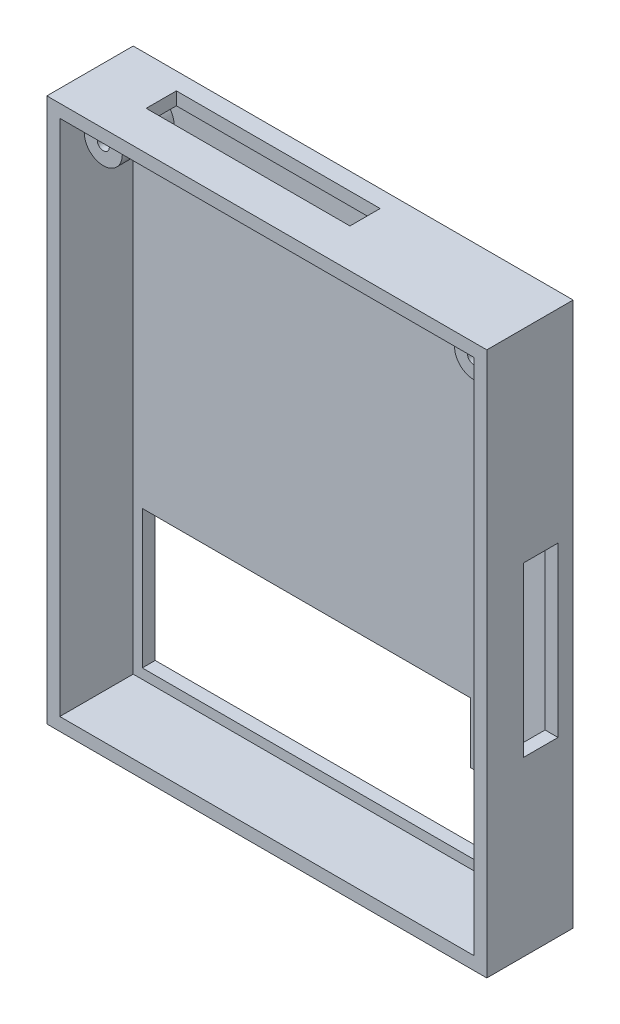
ISO-10303-21;
HEADER;
FILE_DESCRIPTION(('STEP AP214'),'2;1');
FILE_NAME('part.step','',(''),(''),'','','');
FILE_SCHEMA(('AUTOMOTIVE_DESIGN { 1 0 10303 214 1 1 1 1 }'));
ENDSEC;
DATA;
#1=APPLICATION_CONTEXT('core data for automotive mechanical design processes');
#2=APPLICATION_PROTOCOL_DEFINITION('international standard','automotive_design',2000,#1);
#3=PRODUCT_CONTEXT('',#1,'mechanical');
#4=PRODUCT('Part','Part','',(#3));
#5=PRODUCT_RELATED_PRODUCT_CATEGORY('part','',(#4));
#6=PRODUCT_DEFINITION_FORMATION('','',#4);
#7=PRODUCT_DEFINITION_CONTEXT('part definition',#1,'design');
#8=PRODUCT_DEFINITION('design','',#6,#7);
#9=PRODUCT_DEFINITION_SHAPE('','',#8);
#10=(LENGTH_UNIT() NAMED_UNIT(*) SI_UNIT(.MILLI.,.METRE.));
#11=(NAMED_UNIT(*) PLANE_ANGLE_UNIT() SI_UNIT($,.RADIAN.));
#12=(NAMED_UNIT(*) SI_UNIT($,.STERADIAN.) SOLID_ANGLE_UNIT());
#13=UNCERTAINTY_MEASURE_WITH_UNIT(LENGTH_MEASURE(1.E-05),#10,'distance_accuracy_value','');
#14=(GEOMETRIC_REPRESENTATION_CONTEXT(3) GLOBAL_UNCERTAINTY_ASSIGNED_CONTEXT((#13)) GLOBAL_UNIT_ASSIGNED_CONTEXT((#10,
#11,#12)) REPRESENTATION_CONTEXT('',''));
#15=CARTESIAN_POINT('',(0.,0.,0.));
#16=DIRECTION('',(0.,0.,1.));
#17=DIRECTION('',(1.,0.,0.));
#18=AXIS2_PLACEMENT_3D('',#15,#16,#17);
#19=CARTESIAN_POINT('',(0.,0.,3.));
#20=DIRECTION('',(0.,0.,-1.));
#21=DIRECTION('',(-1.,0.,0.));
#22=AXIS2_PLACEMENT_3D('',#19,#20,#21);
#23=PLANE('',#22);
#24=CARTESIAN_POINT('',(93.83,117.93,3.));
#25=DIRECTION('',(0.,0.,-1.));
#26=DIRECTION('',(-1.,0.,0.));
#27=AXIS2_PLACEMENT_3D('',#24,#25,#26);
#28=CIRCLE('',#27,4.4);
#29=CARTESIAN_POINT('',(89.43,117.93,3.));
#30=VERTEX_POINT('',#29);
#31=EDGE_CURVE('E48',#30,#30,#28,.F.);
#32=ORIENTED_EDGE('',*,*,#31,.F.);
#33=EDGE_LOOP('',(#32));
#34=FACE_BOUND('',#33,.T.);
#35=DIRECTION('',(1.,0.,0.));
#36=VECTOR('',#35,1.);
#37=CARTESIAN_POINT('',(5.1,5.3,3.));
#38=LINE('',#37,#36);
#39=CARTESIAN_POINT('',(5.1,5.3,3.));
#40=VERTEX_POINT('',#39);
#41=CARTESIAN_POINT('',(97.1,5.3,3.));
#42=VERTEX_POINT('',#41);
#43=EDGE_CURVE('E321',#40,#42,#38,.T.);
#44=ORIENTED_EDGE('',*,*,#43,.F.);
#45=DIRECTION('',(0.,-1.,0.));
#46=VECTOR('',#45,1.);
#47=CARTESIAN_POINT('',(5.1,37.3,3.));
#48=LINE('',#47,#46);
#49=CARTESIAN_POINT('',(5.1,37.3,3.));
#50=VERTEX_POINT('',#49);
#51=EDGE_CURVE('E309',#50,#40,#48,.T.);
#52=ORIENTED_EDGE('',*,*,#51,.F.);
#53=DIRECTION('',(-1.,0.,0.));
#54=VECTOR('',#53,1.);
#55=CARTESIAN_POINT('',(5.1,37.3,3.));
#56=LINE('',#55,#54);
#57=CARTESIAN_POINT('',(81.1,37.3,3.));
#58=VERTEX_POINT('',#57);
#59=EDGE_CURVE('E337',#58,#50,#56,.T.);
#60=ORIENTED_EDGE('',*,*,#59,.F.);
#61=DIRECTION('',(0.,1.,0.));
#62=VECTOR('',#61,1.);
#63=CARTESIAN_POINT('',(81.1,37.3,3.));
#64=LINE('',#63,#62);
#65=CARTESIAN_POINT('',(81.1,23.3,3.));
#66=VERTEX_POINT('',#65);
#67=EDGE_CURVE('E333',#66,#58,#64,.T.);
#68=ORIENTED_EDGE('',*,*,#67,.F.);
#69=DIRECTION('',(-1.,0.,0.));
#70=VECTOR('',#69,1.);
#71=CARTESIAN_POINT('',(81.1,23.3,3.));
#72=LINE('',#71,#70);
#73=CARTESIAN_POINT('',(97.1,23.3,3.));
#74=VERTEX_POINT('',#73);
#75=EDGE_CURVE('E329',#74,#66,#72,.T.);
#76=ORIENTED_EDGE('',*,*,#75,.F.);
#77=DIRECTION('',(0.,1.,0.));
#78=VECTOR('',#77,1.);
#79=CARTESIAN_POINT('',(97.1,23.3,3.));
#80=LINE('',#79,#78);
#81=EDGE_CURVE('E325',#42,#74,#80,.T.);
#82=ORIENTED_EDGE('',*,*,#81,.F.);
#83=EDGE_LOOP('',(#44,#52,#60,#68,#76,#82));
#84=FACE_BOUND('',#83,.T.);
#85=DIRECTION('',(0.,-1.,0.));
#86=VECTOR('',#85,1.);
#87=CARTESIAN_POINT('',(3.,0.,3.));
#88=LINE('',#87,#86);
#89=CARTESIAN_POINT('',(3.,123.,3.));
#90=VERTEX_POINT('',#89);
#91=CARTESIAN_POINT('',(3.,3.,3.));
#92=VERTEX_POINT('',#91);
#93=EDGE_CURVE('E199',#90,#92,#88,.T.);
#94=ORIENTED_EDGE('',*,*,#93,.T.);
#95=DIRECTION('',(1.,0.,0.));
#96=VECTOR('',#95,1.);
#97=CARTESIAN_POINT('',(0.,3.,3.));
#98=LINE('',#97,#96);
#99=CARTESIAN_POINT('',(98.9,3.,3.));
#100=VERTEX_POINT('',#99);
#101=EDGE_CURVE('E381',#92,#100,#98,.T.);
#102=ORIENTED_EDGE('',*,*,#101,.T.);
#103=DIRECTION('',(0.,1.,0.));
#104=VECTOR('',#103,1.);
#105=CARTESIAN_POINT('',(98.9,0.,3.));
#106=LINE('',#105,#104);
#107=CARTESIAN_POINT('',(98.9,123.,3.));
#108=VERTEX_POINT('',#107);
#109=EDGE_CURVE('E389',#100,#108,#106,.T.);
#110=ORIENTED_EDGE('',*,*,#109,.T.);
#111=DIRECTION('',(-1.,0.,0.));
#112=VECTOR('',#111,1.);
#113=CARTESIAN_POINT('',(0.,123.,3.));
#114=LINE('',#113,#112);
#115=EDGE_CURVE('E204',#108,#90,#114,.T.);
#116=ORIENTED_EDGE('',*,*,#115,.T.);
#117=EDGE_LOOP('',(#94,#102,#110,#116));
#118=FACE_BOUND('',#117,.T.);
#119=CARTESIAN_POINT('',(8.07,117.93,3.));
#120=DIRECTION('',(0.,0.,-1.));
#121=DIRECTION('',(-1.,0.,0.));
#122=AXIS2_PLACEMENT_3D('',#119,#120,#121);
#123=CIRCLE('',#122,4.4);
#124=CARTESIAN_POINT('',(3.67,117.93,3.));
#125=VERTEX_POINT('',#124);
#126=EDGE_CURVE('E11',#125,#125,#123,.F.);
#127=ORIENTED_EDGE('',*,*,#126,.F.);
#128=EDGE_LOOP('',(#127));
#129=FACE_BOUND('',#128,.T.);
#130=ADVANCED_FACE('F39',(#34,#84,#118,#129),#23,.F.);
#131=CARTESIAN_POINT('',(0.,0.,15.));
#132=DIRECTION('',(1.,0.,0.));
#133=DIRECTION('',(0.,0.,-1.));
#134=AXIS2_PLACEMENT_3D('',#131,#132,#133);
#135=PLANE('',#134);
#136=DIRECTION('',(0.,-1.,0.));
#137=VECTOR('',#136,1.);
#138=CARTESIAN_POINT('',(0.,0.,0.));
#139=LINE('',#138,#137);
#140=CARTESIAN_POINT('',(0.,126.,0.));
#141=VERTEX_POINT('',#140);
#142=CARTESIAN_POINT('',(0.,0.,0.));
#143=VERTEX_POINT('',#142);
#144=EDGE_CURVE('E384',#141,#143,#139,.T.);
#145=ORIENTED_EDGE('',*,*,#144,.T.);
#146=DIRECTION('',(0.,0.,-1.));
#147=VECTOR('',#146,1.);
#148=CARTESIAN_POINT('',(0.,0.,15.));
#149=LINE('',#148,#147);
#150=CARTESIAN_POINT('',(0.,0.,20.));
#151=VERTEX_POINT('',#150);
#152=EDGE_CURVE('E423',#151,#143,#149,.T.);
#153=ORIENTED_EDGE('',*,*,#152,.F.);
#154=DIRECTION('',(0.,-1.,0.));
#155=VECTOR('',#154,1.);
#156=CARTESIAN_POINT('',(0.,126.,20.));
#157=LINE('',#156,#155);
#158=CARTESIAN_POINT('',(0.,126.,20.));
#159=VERTEX_POINT('',#158);
#160=EDGE_CURVE('E230',#159,#151,#157,.T.);
#161=ORIENTED_EDGE('',*,*,#160,.F.);
#162=DIRECTION('',(0.,0.,-1.));
#163=VECTOR('',#162,1.);
#164=CARTESIAN_POINT('',(0.,126.,15.));
#165=LINE('',#164,#163);
#166=EDGE_CURVE('E411',#159,#141,#165,.T.);
#167=ORIENTED_EDGE('',*,*,#166,.T.);
#168=EDGE_LOOP('',(#145,#153,#161,#167));
#169=FACE_BOUND('',#168,.T.);
#170=ADVANCED_FACE('F41',(#169),#135,.F.);
#171=CARTESIAN_POINT('',(0.,0.,15.));
#172=DIRECTION('',(0.,1.,0.));
#173=DIRECTION('',(0.,0.,1.));
#174=AXIS2_PLACEMENT_3D('',#171,#172,#173);
#175=PLANE('',#174);
#176=DIRECTION('',(1.,0.,0.));
#177=VECTOR('',#176,1.);
#178=CARTESIAN_POINT('',(0.,0.,0.));
#179=LINE('',#178,#177);
#180=CARTESIAN_POINT('',(101.9,0.,0.));
#181=VERTEX_POINT('',#180);
#182=EDGE_CURVE('E402',#143,#181,#179,.T.);
#183=ORIENTED_EDGE('',*,*,#182,.T.);
#184=DIRECTION('',(0.,0.,-1.));
#185=VECTOR('',#184,1.);
#186=CARTESIAN_POINT('',(101.9,0.,15.));
#187=LINE('',#186,#185);
#188=CARTESIAN_POINT('',(101.9,0.,20.));
#189=VERTEX_POINT('',#188);
#190=EDGE_CURVE('E419',#189,#181,#187,.T.);
#191=ORIENTED_EDGE('',*,*,#190,.F.);
#192=DIRECTION('',(1.,0.,0.));
#193=VECTOR('',#192,1.);
#194=CARTESIAN_POINT('',(0.,0.,20.));
#195=LINE('',#194,#193);
#196=EDGE_CURVE('E234',#151,#189,#195,.T.);
#197=ORIENTED_EDGE('',*,*,#196,.F.);
#198=ORIENTED_EDGE('',*,*,#152,.T.);
#199=EDGE_LOOP('',(#183,#191,#197,#198));
#200=FACE_BOUND('',#199,.T.);
#201=ADVANCED_FACE('F574',(#200),#175,.F.);
#202=CARTESIAN_POINT('',(101.9,0.,15.));
#203=DIRECTION('',(-1.,0.,0.));
#204=DIRECTION('',(0.,0.,1.));
#205=AXIS2_PLACEMENT_3D('',#202,#203,#204);
#206=PLANE('',#205);
#207=DIRECTION('',(0.,0.,-1.));
#208=VECTOR('',#207,1.);
#209=CARTESIAN_POINT('',(101.9,40.,11.5));
#210=LINE('',#209,#208);
#211=CARTESIAN_POINT('',(101.9,40.,11.5));
#212=VERTEX_POINT('',#211);
#213=CARTESIAN_POINT('',(101.9,40.,3.5));
#214=VERTEX_POINT('',#213);
#215=EDGE_CURVE('E293',#212,#214,#210,.T.);
#216=ORIENTED_EDGE('',*,*,#215,.F.);
#217=DIRECTION('',(0.,-1.,0.));
#218=VECTOR('',#217,1.);
#219=CARTESIAN_POINT('',(101.9,79.,11.5));
#220=LINE('',#219,#218);
#221=CARTESIAN_POINT('',(101.9,79.,11.5));
#222=VERTEX_POINT('',#221);
#223=EDGE_CURVE('E283',#222,#212,#220,.T.);
#224=ORIENTED_EDGE('',*,*,#223,.F.);
#225=DIRECTION('',(0.,0.,1.));
#226=VECTOR('',#225,1.);
#227=CARTESIAN_POINT('',(101.9,79.,11.5));
#228=LINE('',#227,#226);
#229=CARTESIAN_POINT('',(101.9,79.,3.5));
#230=VERTEX_POINT('',#229);
#231=EDGE_CURVE('E301',#230,#222,#228,.T.);
#232=ORIENTED_EDGE('',*,*,#231,.F.);
#233=DIRECTION('',(0.,1.,0.));
#234=VECTOR('',#233,1.);
#235=CARTESIAN_POINT('',(101.9,79.,3.5));
#236=LINE('',#235,#234);
#237=EDGE_CURVE('E297',#214,#230,#236,.T.);
#238=ORIENTED_EDGE('',*,*,#237,.F.);
#239=EDGE_LOOP('',(#216,#224,#232,#238));
#240=FACE_BOUND('',#239,.T.);
#241=DIRECTION('',(0.,1.,0.));
#242=VECTOR('',#241,1.);
#243=CARTESIAN_POINT('',(101.9,0.,0.));
#244=LINE('',#243,#242);
#245=CARTESIAN_POINT('',(101.9,126.,0.));
#246=VERTEX_POINT('',#245);
#247=EDGE_CURVE('E405',#181,#246,#244,.T.);
#248=ORIENTED_EDGE('',*,*,#247,.T.);
#249=DIRECTION('',(0.,0.,-1.));
#250=VECTOR('',#249,1.);
#251=CARTESIAN_POINT('',(101.9,126.,15.));
#252=LINE('',#251,#250);
#253=CARTESIAN_POINT('',(101.9,126.,20.));
#254=VERTEX_POINT('',#253);
#255=EDGE_CURVE('E415',#254,#246,#252,.T.);
#256=ORIENTED_EDGE('',*,*,#255,.F.);
#257=DIRECTION('',(0.,1.,0.));
#258=VECTOR('',#257,1.);
#259=CARTESIAN_POINT('',(101.9,0.,20.));
#260=LINE('',#259,#258);
#261=EDGE_CURVE('E238',#189,#254,#260,.T.);
#262=ORIENTED_EDGE('',*,*,#261,.F.);
#263=ORIENTED_EDGE('',*,*,#190,.T.);
#264=EDGE_LOOP('',(#248,#256,#262,#263));
#265=FACE_BOUND('',#264,.T.);
#266=ADVANCED_FACE('F571',(#240,#265),#206,.F.);
#267=CARTESIAN_POINT('',(0.,126.,15.));
#268=DIRECTION('',(0.,-1.,0.));
#269=DIRECTION('',(0.,0.,-1.));
#270=AXIS2_PLACEMENT_3D('',#267,#268,#269);
#271=PLANE('',#270);
#272=DIRECTION('',(1.,0.,0.));
#273=VECTOR('',#272,1.);
#274=CARTESIAN_POINT('',(14.,126.,11.));
#275=LINE('',#274,#273);
#276=CARTESIAN_POINT('',(14.,126.,11.));
#277=VERTEX_POINT('',#276);
#278=CARTESIAN_POINT('',(61.2,126.,11.));
#279=VERTEX_POINT('',#278);
#280=EDGE_CURVE('E268',#277,#279,#275,.T.);
#281=ORIENTED_EDGE('',*,*,#280,.F.);
#282=DIRECTION('',(0.,0.,1.));
#283=VECTOR('',#282,1.);
#284=CARTESIAN_POINT('',(14.,126.,4.));
#285=LINE('',#284,#283);
#286=CARTESIAN_POINT('',(14.,126.,4.));
#287=VERTEX_POINT('',#286);
#288=EDGE_CURVE('E55',#287,#277,#285,.T.);
#289=ORIENTED_EDGE('',*,*,#288,.F.);
#290=DIRECTION('',(-1.,0.,0.));
#291=VECTOR('',#290,1.);
#292=CARTESIAN_POINT('',(14.,126.,4.));
#293=LINE('',#292,#291);
#294=CARTESIAN_POINT('',(61.2,126.,4.));
#295=VERTEX_POINT('',#294);
#296=EDGE_CURVE('E275',#295,#287,#293,.T.);
#297=ORIENTED_EDGE('',*,*,#296,.F.);
#298=DIRECTION('',(0.,0.,-1.));
#299=VECTOR('',#298,1.);
#300=CARTESIAN_POINT('',(61.2,126.,4.));
#301=LINE('',#300,#299);
#302=EDGE_CURVE('E271',#279,#295,#301,.T.);
#303=ORIENTED_EDGE('',*,*,#302,.F.);
#304=EDGE_LOOP('',(#281,#289,#297,#303));
#305=FACE_BOUND('',#304,.T.);
#306=DIRECTION('',(-1.,0.,0.));
#307=VECTOR('',#306,1.);
#308=CARTESIAN_POINT('',(0.,126.,0.));
#309=LINE('',#308,#307);
#310=EDGE_CURVE('E408',#246,#141,#309,.T.);
#311=ORIENTED_EDGE('',*,*,#310,.T.);
#312=ORIENTED_EDGE('',*,*,#166,.F.);
#313=DIRECTION('',(-1.,0.,0.));
#314=VECTOR('',#313,1.);
#315=CARTESIAN_POINT('',(101.9,126.,20.));
#316=LINE('',#315,#314);
#317=EDGE_CURVE('E226',#254,#159,#316,.T.);
#318=ORIENTED_EDGE('',*,*,#317,.F.);
#319=ORIENTED_EDGE('',*,*,#255,.T.);
#320=EDGE_LOOP('',(#311,#312,#318,#319));
#321=FACE_BOUND('',#320,.T.);
#322=ADVANCED_FACE('F567',(#305,#321),#271,.F.);
#323=CARTESIAN_POINT('',(0.,0.,0.));
#324=DIRECTION('',(0.,0.,-1.));
#325=DIRECTION('',(-1.,0.,0.));
#326=AXIS2_PLACEMENT_3D('',#323,#324,#325);
#327=PLANE('',#326);
#328=CARTESIAN_POINT('',(8.07,117.93,0.));
#329=DIRECTION('',(0.,0.,-1.));
#330=DIRECTION('',(-1.,0.,0.));
#331=AXIS2_PLACEMENT_3D('',#328,#329,#330);
#332=CIRCLE('',#331,1.4);
#333=CARTESIAN_POINT('',(6.67,117.93,0.));
#334=VERTEX_POINT('',#333);
#335=EDGE_CURVE('E262',#334,#334,#332,.T.);
#336=ORIENTED_EDGE('',*,*,#335,.F.);
#337=EDGE_LOOP('',(#336));
#338=FACE_BOUND('',#337,.T.);
#339=CARTESIAN_POINT('',(93.83,117.93,0.));
#340=DIRECTION('',(0.,0.,-1.));
#341=DIRECTION('',(-1.,0.,0.));
#342=AXIS2_PLACEMENT_3D('',#339,#340,#341);
#343=CIRCLE('',#342,1.4);
#344=CARTESIAN_POINT('',(92.43,117.93,0.));
#345=VERTEX_POINT('',#344);
#346=EDGE_CURVE('E258',#345,#345,#343,.T.);
#347=ORIENTED_EDGE('',*,*,#346,.F.);
#348=EDGE_LOOP('',(#347));
#349=FACE_BOUND('',#348,.T.);
#350=DIRECTION('',(0.,1.,0.));
#351=VECTOR('',#350,1.);
#352=CARTESIAN_POINT('',(5.1,0.,0.));
#353=LINE('',#352,#351);
#354=CARTESIAN_POINT('',(5.1,5.3,0.));
#355=VERTEX_POINT('',#354);
#356=CARTESIAN_POINT('',(5.1,37.3,0.));
#357=VERTEX_POINT('',#356);
#358=EDGE_CURVE('E376',#355,#357,#353,.T.);
#359=ORIENTED_EDGE('',*,*,#358,.F.);
#360=DIRECTION('',(-1.,0.,0.));
#361=VECTOR('',#360,1.);
#362=CARTESIAN_POINT('',(0.,5.3,0.));
#363=LINE('',#362,#361);
#364=CARTESIAN_POINT('',(97.1,5.3,0.));
#365=VERTEX_POINT('',#364);
#366=EDGE_CURVE('E345',#365,#355,#363,.T.);
#367=ORIENTED_EDGE('',*,*,#366,.F.);
#368=DIRECTION('',(0.,-1.,0.));
#369=VECTOR('',#368,1.);
#370=CARTESIAN_POINT('',(97.1,0.,0.));
#371=LINE('',#370,#369);
#372=CARTESIAN_POINT('',(97.1,23.3,0.));
#373=VERTEX_POINT('',#372);
#374=EDGE_CURVE('E363',#373,#365,#371,.T.);
#375=ORIENTED_EDGE('',*,*,#374,.F.);
#376=DIRECTION('',(1.,0.,0.));
#377=VECTOR('',#376,1.);
#378=CARTESIAN_POINT('',(0.,23.3,0.));
#379=LINE('',#378,#377);
#380=CARTESIAN_POINT('',(81.1,23.3,0.));
#381=VERTEX_POINT('',#380);
#382=EDGE_CURVE('E367',#381,#373,#379,.T.);
#383=ORIENTED_EDGE('',*,*,#382,.F.);
#384=DIRECTION('',(0.,-1.,0.));
#385=VECTOR('',#384,1.);
#386=CARTESIAN_POINT('',(81.1,0.,0.));
#387=LINE('',#386,#385);
#388=CARTESIAN_POINT('',(81.1,37.3,0.));
#389=VERTEX_POINT('',#388);
#390=EDGE_CURVE('E370',#389,#381,#387,.T.);
#391=ORIENTED_EDGE('',*,*,#390,.F.);
#392=DIRECTION('',(1.,0.,0.));
#393=VECTOR('',#392,1.);
#394=CARTESIAN_POINT('',(0.,37.3,0.));
#395=LINE('',#394,#393);
#396=EDGE_CURVE('E373',#357,#389,#395,.T.);
#397=ORIENTED_EDGE('',*,*,#396,.F.);
#398=EDGE_LOOP('',(#359,#367,#375,#383,#391,#397));
#399=FACE_BOUND('',#398,.T.);
#400=ORIENTED_EDGE('',*,*,#144,.F.);
#401=ORIENTED_EDGE('',*,*,#310,.F.);
#402=ORIENTED_EDGE('',*,*,#247,.F.);
#403=ORIENTED_EDGE('',*,*,#182,.F.);
#404=EDGE_LOOP('',(#400,#401,#402,#403));
#405=FACE_BOUND('',#404,.T.);
#406=ADVANCED_FACE('F554',(#338,#349,#399,#405),#327,.T.);
#407=CARTESIAN_POINT('',(3.,0.,15.));
#408=DIRECTION('',(1.,0.,0.));
#409=DIRECTION('',(0.,0.,-1.));
#410=AXIS2_PLACEMENT_3D('',#407,#408,#409);
#411=PLANE('',#410);
#412=ORIENTED_EDGE('',*,*,#93,.F.);
#413=DIRECTION('',(0.,0.,-1.));
#414=VECTOR('',#413,1.);
#415=CARTESIAN_POINT('',(3.,123.,15.));
#416=LINE('',#415,#414);
#417=CARTESIAN_POINT('',(3.,123.,20.));
#418=VERTEX_POINT('',#417);
#419=EDGE_CURVE('E191',#418,#90,#416,.T.);
#420=ORIENTED_EDGE('',*,*,#419,.F.);
#421=DIRECTION('',(0.,-1.,0.));
#422=VECTOR('',#421,1.);
#423=CARTESIAN_POINT('',(3.,123.,20.));
#424=LINE('',#423,#422);
#425=CARTESIAN_POINT('',(3.,3.,20.));
#426=VERTEX_POINT('',#425);
#427=EDGE_CURVE('E196',#418,#426,#424,.T.);
#428=ORIENTED_EDGE('',*,*,#427,.T.);
#429=DIRECTION('',(0.,0.,-1.));
#430=VECTOR('',#429,1.);
#431=CARTESIAN_POINT('',(3.,3.,15.));
#432=LINE('',#431,#430);
#433=EDGE_CURVE('E382',#426,#92,#432,.T.);
#434=ORIENTED_EDGE('',*,*,#433,.T.);
#435=EDGE_LOOP('',(#412,#420,#428,#434));
#436=FACE_BOUND('',#435,.T.);
#437=ADVANCED_FACE('F193',(#436),#411,.T.);
#438=CARTESIAN_POINT('',(0.,3.,15.));
#439=DIRECTION('',(0.,1.,0.));
#440=DIRECTION('',(0.,0.,1.));
#441=AXIS2_PLACEMENT_3D('',#438,#439,#440);
#442=PLANE('',#441);
#443=ORIENTED_EDGE('',*,*,#101,.F.);
#444=ORIENTED_EDGE('',*,*,#433,.F.);
#445=DIRECTION('',(1.,0.,0.));
#446=VECTOR('',#445,1.);
#447=CARTESIAN_POINT('',(3.,3.,20.));
#448=LINE('',#447,#446);
#449=CARTESIAN_POINT('',(98.9,3.,20.));
#450=VERTEX_POINT('',#449);
#451=EDGE_CURVE('E217',#426,#450,#448,.T.);
#452=ORIENTED_EDGE('',*,*,#451,.T.);
#453=DIRECTION('',(0.,0.,-1.));
#454=VECTOR('',#453,1.);
#455=CARTESIAN_POINT('',(98.9,3.,15.));
#456=LINE('',#455,#454);
#457=EDGE_CURVE('E385',#450,#100,#456,.T.);
#458=ORIENTED_EDGE('',*,*,#457,.T.);
#459=EDGE_LOOP('',(#443,#444,#452,#458));
#460=FACE_BOUND('',#459,.T.);
#461=ADVANCED_FACE('F553',(#460),#442,.T.);
#462=CARTESIAN_POINT('',(98.9,0.,15.));
#463=DIRECTION('',(-1.,0.,0.));
#464=DIRECTION('',(0.,0.,1.));
#465=AXIS2_PLACEMENT_3D('',#462,#463,#464);
#466=PLANE('',#465);
#467=DIRECTION('',(0.,1.,0.));
#468=VECTOR('',#467,1.);
#469=CARTESIAN_POINT('',(98.9,0.,11.5));
#470=LINE('',#469,#468);
#471=CARTESIAN_POINT('',(98.9,40.,11.5));
#472=VERTEX_POINT('',#471);
#473=CARTESIAN_POINT('',(98.9,79.,11.5));
#474=VERTEX_POINT('',#473);
#475=EDGE_CURVE('E437',#472,#474,#470,.T.);
#476=ORIENTED_EDGE('',*,*,#475,.F.);
#477=DIRECTION('',(0.,0.,1.));
#478=VECTOR('',#477,1.);
#479=CARTESIAN_POINT('',(98.9,40.,15.));
#480=LINE('',#479,#478);
#481=CARTESIAN_POINT('',(98.9,40.,3.5));
#482=VERTEX_POINT('',#481);
#483=EDGE_CURVE('E427',#482,#472,#480,.T.);
#484=ORIENTED_EDGE('',*,*,#483,.F.);
#485=DIRECTION('',(0.,-1.,0.));
#486=VECTOR('',#485,1.);
#487=CARTESIAN_POINT('',(98.9,0.,3.50000000000001));
#488=LINE('',#487,#486);
#489=CARTESIAN_POINT('',(98.9,79.,3.5));
#490=VERTEX_POINT('',#489);
#491=EDGE_CURVE('E430',#490,#482,#488,.T.);
#492=ORIENTED_EDGE('',*,*,#491,.F.);
#493=DIRECTION('',(0.,0.,-1.));
#494=VECTOR('',#493,1.);
#495=CARTESIAN_POINT('',(98.9,79.,15.));
#496=LINE('',#495,#494);
#497=EDGE_CURVE('E434',#474,#490,#496,.T.);
#498=ORIENTED_EDGE('',*,*,#497,.F.);
#499=EDGE_LOOP('',(#476,#484,#492,#498));
#500=FACE_BOUND('',#499,.T.);
#501=ORIENTED_EDGE('',*,*,#109,.F.);
#502=ORIENTED_EDGE('',*,*,#457,.F.);
#503=DIRECTION('',(0.,1.,0.));
#504=VECTOR('',#503,1.);
#505=CARTESIAN_POINT('',(98.9,3.,20.));
#506=LINE('',#505,#504);
#507=CARTESIAN_POINT('',(98.9,123.,20.));
#508=VERTEX_POINT('',#507);
#509=EDGE_CURVE('E221',#450,#508,#506,.T.);
#510=ORIENTED_EDGE('',*,*,#509,.T.);
#511=DIRECTION('',(0.,0.,-1.));
#512=VECTOR('',#511,1.);
#513=CARTESIAN_POINT('',(98.9,123.,15.));
#514=LINE('',#513,#512);
#515=EDGE_CURVE('E203',#508,#108,#514,.T.);
#516=ORIENTED_EDGE('',*,*,#515,.T.);
#517=EDGE_LOOP('',(#501,#502,#510,#516));
#518=FACE_BOUND('',#517,.T.);
#519=ADVANCED_FACE('F557',(#500,#518),#466,.T.);
#520=CARTESIAN_POINT('',(0.,123.,15.));
#521=DIRECTION('',(0.,-1.,0.));
#522=DIRECTION('',(0.,0.,-1.));
#523=AXIS2_PLACEMENT_3D('',#520,#521,#522);
#524=PLANE('',#523);
#525=DIRECTION('',(0.,0.,-1.));
#526=VECTOR('',#525,1.);
#527=CARTESIAN_POINT('',(14.,123.,15.));
#528=LINE('',#527,#526);
#529=CARTESIAN_POINT('',(14.,123.,11.));
#530=VERTEX_POINT('',#529);
#531=CARTESIAN_POINT('',(14.,123.,4.));
#532=VERTEX_POINT('',#531);
#533=EDGE_CURVE('E449',#530,#532,#528,.T.);
#534=ORIENTED_EDGE('',*,*,#533,.F.);
#535=DIRECTION('',(-1.,0.,0.));
#536=VECTOR('',#535,1.);
#537=CARTESIAN_POINT('',(0.,123.,11.));
#538=LINE('',#537,#536);
#539=CARTESIAN_POINT('',(61.2,123.,11.));
#540=VERTEX_POINT('',#539);
#541=EDGE_CURVE('E440',#540,#530,#538,.T.);
#542=ORIENTED_EDGE('',*,*,#541,.F.);
#543=DIRECTION('',(0.,0.,1.));
#544=VECTOR('',#543,1.);
#545=CARTESIAN_POINT('',(61.2,123.,15.));
#546=LINE('',#545,#544);
#547=CARTESIAN_POINT('',(61.2,123.,4.));
#548=VERTEX_POINT('',#547);
#549=EDGE_CURVE('E443',#548,#540,#546,.T.);
#550=ORIENTED_EDGE('',*,*,#549,.F.);
#551=DIRECTION('',(1.,0.,0.));
#552=VECTOR('',#551,1.);
#553=CARTESIAN_POINT('',(0.,123.,4.));
#554=LINE('',#553,#552);
#555=EDGE_CURVE('E446',#532,#548,#554,.T.);
#556=ORIENTED_EDGE('',*,*,#555,.F.);
#557=EDGE_LOOP('',(#534,#542,#550,#556));
#558=FACE_BOUND('',#557,.T.);
#559=ORIENTED_EDGE('',*,*,#115,.F.);
#560=ORIENTED_EDGE('',*,*,#515,.F.);
#561=DIRECTION('',(-1.,0.,0.));
#562=VECTOR('',#561,1.);
#563=CARTESIAN_POINT('',(98.9,123.,20.));
#564=LINE('',#563,#562);
#565=EDGE_CURVE('E207',#508,#418,#564,.T.);
#566=ORIENTED_EDGE('',*,*,#565,.T.);
#567=ORIENTED_EDGE('',*,*,#419,.T.);
#568=EDGE_LOOP('',(#559,#560,#566,#567));
#569=FACE_BOUND('',#568,.T.);
#570=ADVANCED_FACE('F208',(#558,#569),#524,.T.);
#571=CARTESIAN_POINT('',(5.1,37.3,-12.));
#572=DIRECTION('',(-1.,0.,0.));
#573=DIRECTION('',(0.,-1.,0.));
#574=AXIS2_PLACEMENT_3D('',#571,#572,#573);
#575=PLANE('',#574);
#576=ORIENTED_EDGE('',*,*,#358,.T.);
#577=DIRECTION('',(0.,0.,1.));
#578=VECTOR('',#577,1.);
#579=CARTESIAN_POINT('',(5.1,37.3,-12.));
#580=LINE('',#579,#578);
#581=EDGE_CURVE('E342',#357,#50,#580,.T.);
#582=ORIENTED_EDGE('',*,*,#581,.T.);
#583=ORIENTED_EDGE('',*,*,#51,.T.);
#584=DIRECTION('',(0.,0.,1.));
#585=VECTOR('',#584,1.);
#586=CARTESIAN_POINT('',(5.1,5.3,-12.));
#587=LINE('',#586,#585);
#588=EDGE_CURVE('E341',#355,#40,#587,.T.);
#589=ORIENTED_EDGE('',*,*,#588,.F.);
#590=EDGE_LOOP('',(#576,#582,#583,#589));
#591=FACE_BOUND('',#590,.T.);
#592=ADVANCED_FACE('F532',(#591),#575,.F.);
#593=CARTESIAN_POINT('',(5.1,37.3,-12.));
#594=DIRECTION('',(0.,1.,0.));
#595=DIRECTION('',(0.,0.,1.));
#596=AXIS2_PLACEMENT_3D('',#593,#594,#595);
#597=PLANE('',#596);
#598=ORIENTED_EDGE('',*,*,#396,.T.);
#599=DIRECTION('',(0.,0.,1.));
#600=VECTOR('',#599,1.);
#601=CARTESIAN_POINT('',(81.1,37.3,-12.));
#602=LINE('',#601,#600);
#603=EDGE_CURVE('E346',#389,#58,#602,.T.);
#604=ORIENTED_EDGE('',*,*,#603,.T.);
#605=ORIENTED_EDGE('',*,*,#59,.T.);
#606=ORIENTED_EDGE('',*,*,#581,.F.);
#607=EDGE_LOOP('',(#598,#604,#605,#606));
#608=FACE_BOUND('',#607,.T.);
#609=ADVANCED_FACE('F528',(#608),#597,.F.);
#610=CARTESIAN_POINT('',(81.1,37.3,-12.));
#611=DIRECTION('',(1.,0.,0.));
#612=DIRECTION('',(0.,0.,-1.));
#613=AXIS2_PLACEMENT_3D('',#610,#611,#612);
#614=PLANE('',#613);
#615=ORIENTED_EDGE('',*,*,#390,.T.);
#616=DIRECTION('',(0.,0.,1.));
#617=VECTOR('',#616,1.);
#618=CARTESIAN_POINT('',(81.1,23.3,-12.));
#619=LINE('',#618,#617);
#620=EDGE_CURVE('E349',#381,#66,#619,.T.);
#621=ORIENTED_EDGE('',*,*,#620,.T.);
#622=ORIENTED_EDGE('',*,*,#67,.T.);
#623=ORIENTED_EDGE('',*,*,#603,.F.);
#624=EDGE_LOOP('',(#615,#621,#622,#623));
#625=FACE_BOUND('',#624,.T.);
#626=ADVANCED_FACE('F531',(#625),#614,.F.);
#627=CARTESIAN_POINT('',(81.1,23.3,-12.));
#628=DIRECTION('',(0.,1.,0.));
#629=DIRECTION('',(0.,0.,1.));
#630=AXIS2_PLACEMENT_3D('',#627,#628,#629);
#631=PLANE('',#630);
#632=ORIENTED_EDGE('',*,*,#382,.T.);
#633=DIRECTION('',(0.,0.,1.));
#634=VECTOR('',#633,1.);
#635=CARTESIAN_POINT('',(97.1,23.3,-12.));
#636=LINE('',#635,#634);
#637=EDGE_CURVE('E352',#373,#74,#636,.T.);
#638=ORIENTED_EDGE('',*,*,#637,.T.);
#639=ORIENTED_EDGE('',*,*,#75,.T.);
#640=ORIENTED_EDGE('',*,*,#620,.F.);
#641=EDGE_LOOP('',(#632,#638,#639,#640));
#642=FACE_BOUND('',#641,.T.);
#643=ADVANCED_FACE('F536',(#642),#631,.F.);
#644=CARTESIAN_POINT('',(97.1,23.3,-12.));
#645=DIRECTION('',(1.,0.,0.));
#646=DIRECTION('',(0.,0.,-1.));
#647=AXIS2_PLACEMENT_3D('',#644,#645,#646);
#648=PLANE('',#647);
#649=ORIENTED_EDGE('',*,*,#374,.T.);
#650=DIRECTION('',(0.,0.,1.));
#651=VECTOR('',#650,1.);
#652=CARTESIAN_POINT('',(97.1,5.3,-12.));
#653=LINE('',#652,#651);
#654=EDGE_CURVE('E355',#365,#42,#653,.T.);
#655=ORIENTED_EDGE('',*,*,#654,.T.);
#656=ORIENTED_EDGE('',*,*,#81,.T.);
#657=ORIENTED_EDGE('',*,*,#637,.F.);
#658=EDGE_LOOP('',(#649,#655,#656,#657));
#659=FACE_BOUND('',#658,.T.);
#660=ADVANCED_FACE('F540',(#659),#648,.F.);
#661=CARTESIAN_POINT('',(5.1,5.3,-12.));
#662=DIRECTION('',(0.,-1.,0.));
#663=DIRECTION('',(0.,0.,-1.));
#664=AXIS2_PLACEMENT_3D('',#661,#662,#663);
#665=PLANE('',#664);
#666=ORIENTED_EDGE('',*,*,#366,.T.);
#667=ORIENTED_EDGE('',*,*,#588,.T.);
#668=ORIENTED_EDGE('',*,*,#43,.T.);
#669=ORIENTED_EDGE('',*,*,#654,.F.);
#670=EDGE_LOOP('',(#666,#667,#668,#669));
#671=FACE_BOUND('',#670,.T.);
#672=ADVANCED_FACE('F526',(#671),#665,.F.);
#673=CARTESIAN_POINT('',(86.9,79.,11.5));
#674=DIRECTION('',(0.,0.,1.));
#675=DIRECTION('',(0.,-1.,0.));
#676=AXIS2_PLACEMENT_3D('',#673,#674,#675);
#677=PLANE('',#676);
#678=ORIENTED_EDGE('',*,*,#475,.T.);
#679=DIRECTION('',(1.,0.,0.));
#680=VECTOR('',#679,1.);
#681=CARTESIAN_POINT('',(86.9,79.,11.5));
#682=LINE('',#681,#680);
#683=EDGE_CURVE('E306',#474,#222,#682,.T.);
#684=ORIENTED_EDGE('',*,*,#683,.T.);
#685=ORIENTED_EDGE('',*,*,#223,.T.);
#686=DIRECTION('',(1.,0.,0.));
#687=VECTOR('',#686,1.);
#688=CARTESIAN_POINT('',(86.9,40.,11.5));
#689=LINE('',#688,#687);
#690=EDGE_CURVE('E305',#472,#212,#689,.T.);
#691=ORIENTED_EDGE('',*,*,#690,.F.);
#692=EDGE_LOOP('',(#678,#684,#685,#691));
#693=FACE_BOUND('',#692,.T.);
#694=ADVANCED_FACE('F516',(#693),#677,.F.);
#695=CARTESIAN_POINT('',(86.9,79.,11.5));
#696=DIRECTION('',(0.,1.,0.));
#697=DIRECTION('',(0.,0.,1.));
#698=AXIS2_PLACEMENT_3D('',#695,#696,#697);
#699=PLANE('',#698);
#700=ORIENTED_EDGE('',*,*,#497,.T.);
#701=DIRECTION('',(1.,0.,0.));
#702=VECTOR('',#701,1.);
#703=CARTESIAN_POINT('',(86.9,79.,3.5));
#704=LINE('',#703,#702);
#705=EDGE_CURVE('E310',#490,#230,#704,.T.);
#706=ORIENTED_EDGE('',*,*,#705,.T.);
#707=ORIENTED_EDGE('',*,*,#231,.T.);
#708=ORIENTED_EDGE('',*,*,#683,.F.);
#709=EDGE_LOOP('',(#700,#706,#707,#708));
#710=FACE_BOUND('',#709,.T.);
#711=ADVANCED_FACE('F512',(#710),#699,.F.);
#712=CARTESIAN_POINT('',(86.9,79.,3.5));
#713=DIRECTION('',(0.,0.,-1.));
#714=DIRECTION('',(0.,1.,0.));
#715=AXIS2_PLACEMENT_3D('',#712,#713,#714);
#716=PLANE('',#715);
#717=ORIENTED_EDGE('',*,*,#491,.T.);
#718=DIRECTION('',(1.,0.,0.));
#719=VECTOR('',#718,1.);
#720=CARTESIAN_POINT('',(86.9,40.,3.5));
#721=LINE('',#720,#719);
#722=EDGE_CURVE('E313',#482,#214,#721,.T.);
#723=ORIENTED_EDGE('',*,*,#722,.T.);
#724=ORIENTED_EDGE('',*,*,#237,.T.);
#725=ORIENTED_EDGE('',*,*,#705,.F.);
#726=EDGE_LOOP('',(#717,#723,#724,#725));
#727=FACE_BOUND('',#726,.T.);
#728=ADVANCED_FACE('F515',(#727),#716,.F.);
#729=CARTESIAN_POINT('',(86.9,40.,11.5));
#730=DIRECTION('',(0.,-1.,0.));
#731=DIRECTION('',(0.,0.,-1.));
#732=AXIS2_PLACEMENT_3D('',#729,#730,#731);
#733=PLANE('',#732);
#734=ORIENTED_EDGE('',*,*,#483,.T.);
#735=ORIENTED_EDGE('',*,*,#690,.T.);
#736=ORIENTED_EDGE('',*,*,#215,.T.);
#737=ORIENTED_EDGE('',*,*,#722,.F.);
#738=EDGE_LOOP('',(#734,#735,#736,#737));
#739=FACE_BOUND('',#738,.T.);
#740=ADVANCED_FACE('F511',(#739),#733,.F.);
#741=CARTESIAN_POINT('',(14.,111.,4.));
#742=DIRECTION('',(-1.,0.,0.));
#743=DIRECTION('',(0.,0.,1.));
#744=AXIS2_PLACEMENT_3D('',#741,#742,#743);
#745=PLANE('',#744);
#746=ORIENTED_EDGE('',*,*,#533,.T.);
#747=DIRECTION('',(0.,1.,0.));
#748=VECTOR('',#747,1.);
#749=CARTESIAN_POINT('',(14.,111.,4.));
#750=LINE('',#749,#748);
#751=EDGE_CURVE('E280',#532,#287,#750,.T.);
#752=ORIENTED_EDGE('',*,*,#751,.T.);
#753=ORIENTED_EDGE('',*,*,#288,.T.);
#754=DIRECTION('',(0.,1.,0.));
#755=VECTOR('',#754,1.);
#756=CARTESIAN_POINT('',(14.,111.,11.));
#757=LINE('',#756,#755);
#758=EDGE_CURVE('E279',#530,#277,#757,.T.);
#759=ORIENTED_EDGE('',*,*,#758,.F.);
#760=EDGE_LOOP('',(#746,#752,#753,#759));
#761=FACE_BOUND('',#760,.T.);
#762=ADVANCED_FACE('F502',(#761),#745,.F.);
#763=CARTESIAN_POINT('',(14.,111.,4.));
#764=DIRECTION('',(0.,0.,-1.));
#765=DIRECTION('',(-1.,0.,0.));
#766=AXIS2_PLACEMENT_3D('',#763,#764,#765);
#767=PLANE('',#766);
#768=ORIENTED_EDGE('',*,*,#555,.T.);
#769=DIRECTION('',(0.,1.,0.));
#770=VECTOR('',#769,1.);
#771=CARTESIAN_POINT('',(61.2,111.,4.));
#772=LINE('',#771,#770);
#773=EDGE_CURVE('E284',#548,#295,#772,.T.);
#774=ORIENTED_EDGE('',*,*,#773,.T.);
#775=ORIENTED_EDGE('',*,*,#296,.T.);
#776=ORIENTED_EDGE('',*,*,#751,.F.);
#777=EDGE_LOOP('',(#768,#774,#775,#776));
#778=FACE_BOUND('',#777,.T.);
#779=ADVANCED_FACE('F498',(#778),#767,.F.);
#780=CARTESIAN_POINT('',(61.2,111.,4.));
#781=DIRECTION('',(1.,0.,0.));
#782=DIRECTION('',(0.,0.,-1.));
#783=AXIS2_PLACEMENT_3D('',#780,#781,#782);
#784=PLANE('',#783);
#785=ORIENTED_EDGE('',*,*,#549,.T.);
#786=DIRECTION('',(0.,1.,0.));
#787=VECTOR('',#786,1.);
#788=CARTESIAN_POINT('',(61.2,111.,11.));
#789=LINE('',#788,#787);
#790=EDGE_CURVE('E63',#540,#279,#789,.T.);
#791=ORIENTED_EDGE('',*,*,#790,.T.);
#792=ORIENTED_EDGE('',*,*,#302,.T.);
#793=ORIENTED_EDGE('',*,*,#773,.F.);
#794=EDGE_LOOP('',(#785,#791,#792,#793));
#795=FACE_BOUND('',#794,.T.);
#796=ADVANCED_FACE('F501',(#795),#784,.F.);
#797=CARTESIAN_POINT('',(14.,111.,11.));
#798=DIRECTION('',(0.,0.,1.));
#799=DIRECTION('',(1.,0.,0.));
#800=AXIS2_PLACEMENT_3D('',#797,#798,#799);
#801=PLANE('',#800);
#802=ORIENTED_EDGE('',*,*,#541,.T.);
#803=ORIENTED_EDGE('',*,*,#758,.T.);
#804=ORIENTED_EDGE('',*,*,#280,.T.);
#805=ORIENTED_EDGE('',*,*,#790,.F.);
#806=EDGE_LOOP('',(#802,#803,#804,#805));
#807=FACE_BOUND('',#806,.T.);
#808=ADVANCED_FACE('F496',(#807),#801,.F.);
#809=CARTESIAN_POINT('',(93.83,117.93,-12.));
#810=DIRECTION('',(0.,0.,1.));
#811=DIRECTION('',(1.,0.,0.));
#812=AXIS2_PLACEMENT_3D('',#809,#810,#811);
#813=CYLINDRICAL_SURFACE('',#812,1.4);
#814=ORIENTED_EDGE('',*,*,#346,.T.);
#815=EDGE_LOOP('',(#814));
#816=FACE_BOUND('',#815,.T.);
#817=CARTESIAN_POINT('',(93.83,117.93,15.));
#818=DIRECTION('',(0.,0.,1.));
#819=DIRECTION('',(1.,0.,0.));
#820=AXIS2_PLACEMENT_3D('',#817,#818,#819);
#821=CIRCLE('',#820,1.4);
#822=CARTESIAN_POINT('',(95.23,117.93,15.));
#823=VERTEX_POINT('',#822);
#824=EDGE_CURVE('E250',#823,#823,#821,.T.);
#825=ORIENTED_EDGE('',*,*,#824,.T.);
#826=EDGE_LOOP('',(#825));
#827=FACE_BOUND('',#826,.T.);
#828=ADVANCED_FACE('F492',(#816,#827),#813,.F.);
#829=CARTESIAN_POINT('',(8.07,117.93,-12.));
#830=DIRECTION('',(0.,0.,1.));
#831=DIRECTION('',(1.,0.,0.));
#832=AXIS2_PLACEMENT_3D('',#829,#830,#831);
#833=CYLINDRICAL_SURFACE('',#832,1.4);
#834=ORIENTED_EDGE('',*,*,#335,.T.);
#835=EDGE_LOOP('',(#834));
#836=FACE_BOUND('',#835,.T.);
#837=CARTESIAN_POINT('',(8.07,117.93,15.));
#838=DIRECTION('',(0.,0.,1.));
#839=DIRECTION('',(1.,0.,0.));
#840=AXIS2_PLACEMENT_3D('',#837,#838,#839);
#841=CIRCLE('',#840,1.4);
#842=CARTESIAN_POINT('',(9.47,117.93,15.));
#843=VERTEX_POINT('',#842);
#844=EDGE_CURVE('E242',#843,#843,#841,.T.);
#845=ORIENTED_EDGE('',*,*,#844,.T.);
#846=EDGE_LOOP('',(#845));
#847=FACE_BOUND('',#846,.T.);
#848=ADVANCED_FACE('F485',(#836,#847),#833,.F.);
#849=CARTESIAN_POINT('',(93.83,117.93,15.));
#850=DIRECTION('',(0.,0.,1.));
#851=DIRECTION('',(1.,0.,0.));
#852=AXIS2_PLACEMENT_3D('',#849,#850,#851);
#853=PLANE('',#852);
#854=CARTESIAN_POINT('',(93.83,117.93,15.));
#855=DIRECTION('',(0.,0.,1.));
#856=DIRECTION('',(1.,0.,0.));
#857=AXIS2_PLACEMENT_3D('',#854,#855,#856);
#858=CIRCLE('',#857,4.4);
#859=CARTESIAN_POINT('',(98.23,117.93,15.));
#860=VERTEX_POINT('',#859);
#861=EDGE_CURVE('E254',#860,#860,#858,.T.);
#862=ORIENTED_EDGE('',*,*,#861,.T.);
#863=EDGE_LOOP('',(#862));
#864=FACE_BOUND('',#863,.T.);
#865=ORIENTED_EDGE('',*,*,#824,.F.);
#866=EDGE_LOOP('',(#865));
#867=FACE_BOUND('',#866,.T.);
#868=ADVANCED_FACE('F482',(#864,#867),#853,.T.);
#869=CARTESIAN_POINT('',(93.83,117.93,15.));
#870=DIRECTION('',(0.,0.,-1.));
#871=DIRECTION('',(-1.,0.,0.));
#872=AXIS2_PLACEMENT_3D('',#869,#870,#871);
#873=CYLINDRICAL_SURFACE('',#872,4.4);
#874=ORIENTED_EDGE('',*,*,#861,.F.);
#875=EDGE_LOOP('',(#874));
#876=FACE_BOUND('',#875,.T.);
#877=ORIENTED_EDGE('',*,*,#31,.T.);
#878=EDGE_LOOP('',(#877));
#879=FACE_BOUND('',#878,.T.);
#880=ADVANCED_FACE('F455',(#876,#879),#873,.T.);
#881=CARTESIAN_POINT('',(8.07,117.93,15.));
#882=DIRECTION('',(0.,0.,1.));
#883=DIRECTION('',(1.,0.,0.));
#884=AXIS2_PLACEMENT_3D('',#881,#882,#883);
#885=PLANE('',#884);
#886=CARTESIAN_POINT('',(8.07,117.93,15.));
#887=DIRECTION('',(0.,0.,1.));
#888=DIRECTION('',(1.,0.,0.));
#889=AXIS2_PLACEMENT_3D('',#886,#887,#888);
#890=CIRCLE('',#889,4.4);
#891=CARTESIAN_POINT('',(12.47,117.93,15.));
#892=VERTEX_POINT('',#891);
#893=EDGE_CURVE('E246',#892,#892,#890,.T.);
#894=ORIENTED_EDGE('',*,*,#893,.T.);
#895=EDGE_LOOP('',(#894));
#896=FACE_BOUND('',#895,.T.);
#897=ORIENTED_EDGE('',*,*,#844,.F.);
#898=EDGE_LOOP('',(#897));
#899=FACE_BOUND('',#898,.T.);
#900=ADVANCED_FACE('F469',(#896,#899),#885,.T.);
#901=CARTESIAN_POINT('',(8.07,117.93,15.));
#902=DIRECTION('',(0.,0.,-1.));
#903=DIRECTION('',(-1.,0.,0.));
#904=AXIS2_PLACEMENT_3D('',#901,#902,#903);
#905=CYLINDRICAL_SURFACE('',#904,4.4);
#906=ORIENTED_EDGE('',*,*,#893,.F.);
#907=EDGE_LOOP('',(#906));
#908=FACE_BOUND('',#907,.T.);
#909=ORIENTED_EDGE('',*,*,#126,.T.);
#910=EDGE_LOOP('',(#909));
#911=FACE_BOUND('',#910,.T.);
#912=ADVANCED_FACE('F467',(#908,#911),#905,.T.);
#913=CARTESIAN_POINT('',(0.,0.,20.));
#914=DIRECTION('',(0.,0.,1.));
#915=DIRECTION('',(1.,0.,0.));
#916=AXIS2_PLACEMENT_3D('',#913,#914,#915);
#917=PLANE('',#916);
#918=ORIENTED_EDGE('',*,*,#317,.T.);
#919=ORIENTED_EDGE('',*,*,#160,.T.);
#920=ORIENTED_EDGE('',*,*,#196,.T.);
#921=ORIENTED_EDGE('',*,*,#261,.T.);
#922=EDGE_LOOP('',(#918,#919,#920,#921));
#923=FACE_BOUND('',#922,.T.);
#924=ORIENTED_EDGE('',*,*,#427,.F.);
#925=ORIENTED_EDGE('',*,*,#565,.F.);
#926=ORIENTED_EDGE('',*,*,#509,.F.);
#927=ORIENTED_EDGE('',*,*,#451,.F.);
#928=EDGE_LOOP('',(#924,#925,#926,#927));
#929=FACE_BOUND('',#928,.T.);
#930=ADVANCED_FACE('F215',(#923,#929),#917,.T.);
#931=CLOSED_SHELL('',(#130,#170,#201,#266,#322,#406,#437,#461,#519,#570,#592,#609,#626,#643,
#660,#672,#694,#711,#728,#740,#762,#779,#796,#808,#828,#848,#868,#880,#900,#912,#930));
#932=MANIFOLD_SOLID_BREP('B2',#931);
#933=ADVANCED_BREP_SHAPE_REPRESENTATION('',(#18,#932),#14);
#934=SHAPE_DEFINITION_REPRESENTATION(#9,#933);
ENDSEC;
END-ISO-10303-21;
